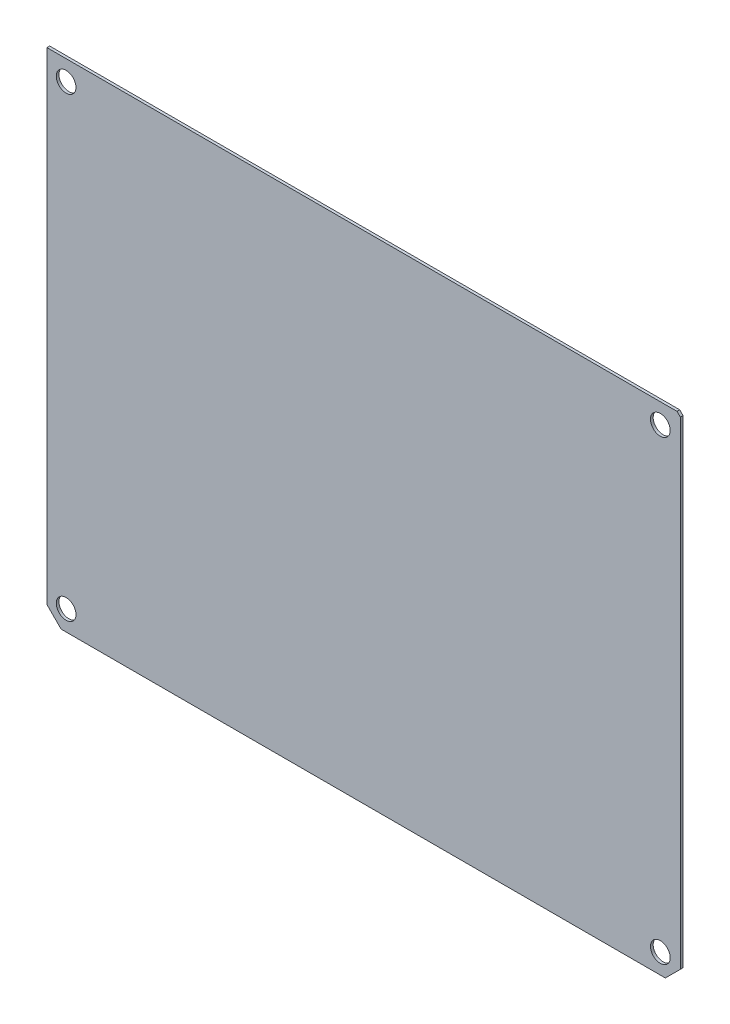
ISO-10303-21;
HEADER;
FILE_DESCRIPTION(('STEP AP214'),'2;1');
FILE_NAME('part.step','',(''),(''),'','','');
FILE_SCHEMA(('AUTOMOTIVE_DESIGN { 1 0 10303 214 1 1 1 1 }'));
ENDSEC;
DATA;
#1=APPLICATION_CONTEXT('core data for automotive mechanical design processes');
#2=APPLICATION_PROTOCOL_DEFINITION('international standard','automotive_design',2000,#1);
#3=PRODUCT_CONTEXT('',#1,'mechanical');
#4=PRODUCT('Part','Part','',(#3));
#5=PRODUCT_RELATED_PRODUCT_CATEGORY('part','',(#4));
#6=PRODUCT_DEFINITION_FORMATION('','',#4);
#7=PRODUCT_DEFINITION_CONTEXT('part definition',#1,'design');
#8=PRODUCT_DEFINITION('design','',#6,#7);
#9=PRODUCT_DEFINITION_SHAPE('','',#8);
#10=(LENGTH_UNIT() NAMED_UNIT(*) SI_UNIT(.MILLI.,.METRE.));
#11=(NAMED_UNIT(*) PLANE_ANGLE_UNIT() SI_UNIT($,.RADIAN.));
#12=(NAMED_UNIT(*) SI_UNIT($,.STERADIAN.) SOLID_ANGLE_UNIT());
#13=UNCERTAINTY_MEASURE_WITH_UNIT(LENGTH_MEASURE(1.E-05),#10,'distance_accuracy_value','');
#14=(GEOMETRIC_REPRESENTATION_CONTEXT(3) GLOBAL_UNCERTAINTY_ASSIGNED_CONTEXT((#13)) GLOBAL_UNIT_ASSIGNED_CONTEXT((#10,
#11,#12)) REPRESENTATION_CONTEXT('',''));
#15=CARTESIAN_POINT('',(0.,0.,0.));
#16=DIRECTION('',(0.,0.,1.));
#17=DIRECTION('',(1.,0.,0.));
#18=AXIS2_PLACEMENT_3D('',#15,#16,#17);
#19=CARTESIAN_POINT('',(143.00199890136,105.66400146484,0.));
#20=DIRECTION('',(0.,0.,-1.));
#21=DIRECTION('',(-1.,0.,0.));
#22=AXIS2_PLACEMENT_3D('',#19,#20,#21);
#23=PLANE('',#22);
#24=CARTESIAN_POINT('',(236.347,176.022,0.));
#25=DIRECTION('',(0.,0.,-1.));
#26=DIRECTION('',(-1.,0.,0.));
#27=AXIS2_PLACEMENT_3D('',#24,#25,#26);
#28=CIRCLE('',#27,1.49999954);
#29=CARTESIAN_POINT('',(234.84700046,176.022,0.));
#30=VERTEX_POINT('',#29);
#31=EDGE_CURVE('E108',#30,#30,#28,.T.);
#32=ORIENTED_EDGE('',*,*,#31,.T.);
#33=EDGE_LOOP('',(#32));
#34=FACE_BOUND('',#33,.T.);
#35=CARTESIAN_POINT('',(236.347,106.553,0.));
#36=DIRECTION('',(0.,0.,-1.));
#37=DIRECTION('',(-1.,0.,0.));
#38=AXIS2_PLACEMENT_3D('',#35,#36,#37);
#39=CIRCLE('',#38,1.49999954);
#40=CARTESIAN_POINT('',(234.84700046,106.553,0.));
#41=VERTEX_POINT('',#40);
#42=EDGE_CURVE('E112',#41,#41,#39,.T.);
#43=ORIENTED_EDGE('',*,*,#42,.T.);
#44=EDGE_LOOP('',(#43));
#45=FACE_BOUND('',#44,.T.);
#46=CARTESIAN_POINT('',(145.923,176.022,0.));
#47=DIRECTION('',(0.,0.,-1.));
#48=DIRECTION('',(-1.,0.,0.));
#49=AXIS2_PLACEMENT_3D('',#46,#47,#48);
#50=CIRCLE('',#49,1.49999954);
#51=CARTESIAN_POINT('',(144.42300046,176.022,0.));
#52=VERTEX_POINT('',#51);
#53=EDGE_CURVE('E114',#52,#52,#50,.T.);
#54=ORIENTED_EDGE('',*,*,#53,.T.);
#55=EDGE_LOOP('',(#54));
#56=FACE_BOUND('',#55,.T.);
#57=CARTESIAN_POINT('',(145.923,106.553,0.));
#58=DIRECTION('',(0.,0.,-1.));
#59=DIRECTION('',(-1.,0.,0.));
#60=AXIS2_PLACEMENT_3D('',#57,#58,#59);
#61=CIRCLE('',#60,1.49999954);
#62=CARTESIAN_POINT('',(144.42300046,106.553,0.));
#63=VERTEX_POINT('',#62);
#64=EDGE_CURVE('E18',#63,#63,#61,.T.);
#65=ORIENTED_EDGE('',*,*,#64,.T.);
#66=EDGE_LOOP('',(#65));
#67=FACE_BOUND('',#66,.T.);
#68=DIRECTION('',(1.,0.,0.));
#69=VECTOR('',#68,1.);
#70=CARTESIAN_POINT('',(145.16099548339,103.50499725341,0.));
#71=LINE('',#70,#69);
#72=CARTESIAN_POINT('',(145.160995483391,103.504997253411,0.));
#73=VERTEX_POINT('',#72);
#74=CARTESIAN_POINT('',(237.10899353027,103.50499725341,0.));
#75=VERTEX_POINT('',#74);
#76=EDGE_CURVE('E130',#73,#75,#71,.T.);
#77=ORIENTED_EDGE('',*,*,#76,.T.);
#78=DIRECTION('',(-0.707107961146063,-0.707105601225063,0.));
#79=VECTOR('',#78,1.);
#80=CARTESIAN_POINT('',(237.10899353027,103.50499725341,0.));
#81=LINE('',#80,#79);
#82=CARTESIAN_POINT('',(239.39500427246,105.79100036621,0.));
#83=VERTEX_POINT('',#82);
#84=EDGE_CURVE('E134',#75,#83,#81,.F.);
#85=ORIENTED_EDGE('',*,*,#84,.T.);
#86=DIRECTION('',(0.,1.,0.));
#87=VECTOR('',#86,1.);
#88=CARTESIAN_POINT('',(239.39500427246,105.79100036621,0.));
#89=LINE('',#88,#87);
#90=CARTESIAN_POINT('',(239.39500427246,178.56199645996,0.));
#91=VERTEX_POINT('',#90);
#92=EDGE_CURVE('E138',#83,#91,#89,.T.);
#93=ORIENTED_EDGE('',*,*,#92,.T.);
#94=DIRECTION('',(0.707106781186548,-0.707106781186548,0.));
#95=VECTOR('',#94,1.);
#96=CARTESIAN_POINT('',(239.39500427246,178.56199645996,0.));
#97=LINE('',#96,#95);
#98=CARTESIAN_POINT('',(238.886993408201,179.070007324211,0.));
#99=VERTEX_POINT('',#98);
#100=EDGE_CURVE('E72',#91,#99,#97,.F.);
#101=ORIENTED_EDGE('',*,*,#100,.T.);
#102=DIRECTION('',(1.,0.,0.));
#103=VECTOR('',#102,1.);
#104=CARTESIAN_POINT('',(238.8869934082,179.07000732421,0.));
#105=LINE('',#104,#103);
#106=CARTESIAN_POINT('',(143.00199890136,179.07000732421,0.));
#107=VERTEX_POINT('',#106);
#108=EDGE_CURVE('E74',#99,#107,#105,.F.);
#109=ORIENTED_EDGE('',*,*,#108,.T.);
#110=DIRECTION('',(0.,1.,0.));
#111=VECTOR('',#110,1.);
#112=CARTESIAN_POINT('',(143.00199890136,179.07000732421,0.));
#113=LINE('',#112,#111);
#114=CARTESIAN_POINT('',(143.00199890136,105.66400146484,0.));
#115=VERTEX_POINT('',#114);
#116=EDGE_CURVE('E76',#107,#115,#113,.F.);
#117=ORIENTED_EDGE('',*,*,#116,.T.);
#118=DIRECTION('',(-0.707105531811944,0.707108030558944,0.));
#119=VECTOR('',#118,1.);
#120=CARTESIAN_POINT('',(143.00199890136,105.66400146484,0.));
#121=LINE('',#120,#119);
#122=EDGE_CURVE('E121',#115,#73,#121,.F.);
#123=ORIENTED_EDGE('',*,*,#122,.T.);
#124=EDGE_LOOP('',(#77,#85,#93,#101,#109,#117,#123));
#125=FACE_BOUND('',#124,.T.);
#126=ADVANCED_FACE('F15',(#34,#45,#56,#67,#125),#23,.F.);
#127=CARTESIAN_POINT('',(143.00199890136,179.07000732421,-0.41148));
#128=DIRECTION('',(1.,0.,0.));
#129=DIRECTION('',(0.,0.,-1.));
#130=AXIS2_PLACEMENT_3D('',#127,#128,#129);
#131=PLANE('',#130);
#132=DIRECTION('',(0.,0.,1.));
#133=VECTOR('',#132,1.);
#134=CARTESIAN_POINT('',(143.00199890136,105.66400146484,-0.41148));
#135=LINE('',#134,#133);
#136=CARTESIAN_POINT('',(143.00199890136,105.66400146484,-0.41148));
#137=VERTEX_POINT('',#136);
#138=EDGE_CURVE('E87',#137,#115,#135,.T.);
#139=ORIENTED_EDGE('',*,*,#138,.T.);
#140=ORIENTED_EDGE('',*,*,#116,.F.);
#141=DIRECTION('',(0.,0.,-1.));
#142=VECTOR('',#141,1.);
#143=CARTESIAN_POINT('',(143.00199890136,179.07000732421,-0.41148));
#144=LINE('',#143,#142);
#145=CARTESIAN_POINT('',(143.00199890136,179.07000732421,-0.41148));
#146=VERTEX_POINT('',#145);
#147=EDGE_CURVE('E81',#107,#146,#144,.T.);
#148=ORIENTED_EDGE('',*,*,#147,.T.);
#149=DIRECTION('',(0.,1.,0.));
#150=VECTOR('',#149,1.);
#151=CARTESIAN_POINT('',(143.00199890136,105.66400146484,-0.41148));
#152=LINE('',#151,#150);
#153=EDGE_CURVE('E111',#137,#146,#152,.T.);
#154=ORIENTED_EDGE('',*,*,#153,.F.);
#155=EDGE_LOOP('',(#139,#140,#148,#154));
#156=FACE_BOUND('',#155,.T.);
#157=ADVANCED_FACE('F84',(#156),#131,.F.);
#158=CARTESIAN_POINT('',(238.8869934082,179.07000732421,-0.41148));
#159=DIRECTION('',(0.,-1.,0.));
#160=DIRECTION('',(0.,0.,-1.));
#161=AXIS2_PLACEMENT_3D('',#158,#159,#160);
#162=PLANE('',#161);
#163=ORIENTED_EDGE('',*,*,#147,.F.);
#164=ORIENTED_EDGE('',*,*,#108,.F.);
#165=DIRECTION('',(0.,0.,1.));
#166=VECTOR('',#165,1.);
#167=CARTESIAN_POINT('',(238.886993408205,179.070007324215,-0.41148));
#168=LINE('',#167,#166);
#169=CARTESIAN_POINT('',(238.886993408201,179.070007324211,-0.41148));
#170=VERTEX_POINT('',#169);
#171=EDGE_CURVE('E95',#99,#170,#168,.F.);
#172=ORIENTED_EDGE('',*,*,#171,.T.);
#173=DIRECTION('',(-1.,0.,0.));
#174=VECTOR('',#173,1.);
#175=CARTESIAN_POINT('',(143.00199890136,179.07000732421,-0.41148));
#176=LINE('',#175,#174);
#177=EDGE_CURVE('E92',#146,#170,#176,.F.);
#178=ORIENTED_EDGE('',*,*,#177,.F.);
#179=EDGE_LOOP('',(#163,#164,#172,#178));
#180=FACE_BOUND('',#179,.T.);
#181=ADVANCED_FACE('F90',(#180),#162,.F.);
#182=CARTESIAN_POINT('',(239.39500427246,178.56199645996,-0.41148));
#183=DIRECTION('',(-0.707106781186548,-0.707106781186548,0.));
#184=DIRECTION('',(0.707106781186548,-0.707106781186548,0.));
#185=AXIS2_PLACEMENT_3D('',#182,#183,#184);
#186=PLANE('',#185);
#187=ORIENTED_EDGE('',*,*,#171,.F.);
#188=ORIENTED_EDGE('',*,*,#100,.F.);
#189=DIRECTION('',(0.,0.,1.));
#190=VECTOR('',#189,1.);
#191=CARTESIAN_POINT('',(239.39500427246,178.56199645996,-0.41148));
#192=LINE('',#191,#190);
#193=CARTESIAN_POINT('',(239.39500427246,178.56199645996,-0.41148));
#194=VERTEX_POINT('',#193);
#195=EDGE_CURVE('E136',#91,#194,#192,.F.);
#196=ORIENTED_EDGE('',*,*,#195,.T.);
#197=DIRECTION('',(0.707106781193521,-0.707106781179574,0.));
#198=VECTOR('',#197,1.);
#199=CARTESIAN_POINT('',(238.8869934082,179.07000732421,-0.41148));
#200=LINE('',#199,#198);
#201=EDGE_CURVE('E142',#170,#194,#200,.T.);
#202=ORIENTED_EDGE('',*,*,#201,.F.);
#203=EDGE_LOOP('',(#187,#188,#196,#202));
#204=FACE_BOUND('',#203,.T.);
#205=ADVANCED_FACE('F143',(#204),#186,.F.);
#206=CARTESIAN_POINT('',(239.39500427246,105.79100036621,-0.41148));
#207=DIRECTION('',(-1.,0.,0.));
#208=DIRECTION('',(0.,0.,1.));
#209=AXIS2_PLACEMENT_3D('',#206,#207,#208);
#210=PLANE('',#209);
#211=ORIENTED_EDGE('',*,*,#195,.F.);
#212=ORIENTED_EDGE('',*,*,#92,.F.);
#213=DIRECTION('',(0.,0.,1.));
#214=VECTOR('',#213,1.);
#215=CARTESIAN_POINT('',(239.395004272462,105.791000366208,-0.41148));
#216=LINE('',#215,#214);
#217=CARTESIAN_POINT('',(239.39500427246,105.79100036621,-0.41148));
#218=VERTEX_POINT('',#217);
#219=EDGE_CURVE('E132',#83,#218,#216,.F.);
#220=ORIENTED_EDGE('',*,*,#219,.T.);
#221=DIRECTION('',(0.,1.,0.));
#222=VECTOR('',#221,1.);
#223=CARTESIAN_POINT('',(239.39500427246,105.66400146484,-0.41148));
#224=LINE('',#223,#222);
#225=EDGE_CURVE('E148',#194,#218,#224,.F.);
#226=ORIENTED_EDGE('',*,*,#225,.F.);
#227=EDGE_LOOP('',(#211,#212,#220,#226));
#228=FACE_BOUND('',#227,.T.);
#229=ADVANCED_FACE('F171',(#228),#210,.F.);
#230=CARTESIAN_POINT('',(237.10899353027,103.50499725341,-0.41148));
#231=DIRECTION('',(-0.707105601225063,0.707107961146063,0.));
#232=DIRECTION('',(-0.707107961146063,-0.707105601225063,0.));
#233=AXIS2_PLACEMENT_3D('',#230,#231,#232);
#234=PLANE('',#233);
#235=ORIENTED_EDGE('',*,*,#219,.F.);
#236=ORIENTED_EDGE('',*,*,#84,.F.);
#237=DIRECTION('',(0.,0.,1.));
#238=VECTOR('',#237,1.);
#239=CARTESIAN_POINT('',(237.10899353027,103.50499725341,-0.41148));
#240=LINE('',#239,#238);
#241=CARTESIAN_POINT('',(237.10899353027,103.50499725341,-0.41148));
#242=VERTEX_POINT('',#241);
#243=EDGE_CURVE('E128',#75,#242,#240,.F.);
#244=ORIENTED_EDGE('',*,*,#243,.T.);
#245=DIRECTION('',(-0.707107961145546,-0.70710560122558,0.));
#246=VECTOR('',#245,1.);
#247=CARTESIAN_POINT('',(239.39500427246,105.79100036621,-0.41148));
#248=LINE('',#247,#246);
#249=EDGE_CURVE('E155',#218,#242,#248,.T.);
#250=ORIENTED_EDGE('',*,*,#249,.F.);
#251=EDGE_LOOP('',(#235,#236,#244,#250));
#252=FACE_BOUND('',#251,.T.);
#253=ADVANCED_FACE('F168',(#252),#234,.F.);
#254=CARTESIAN_POINT('',(145.16099548339,103.50499725341,-0.41148));
#255=DIRECTION('',(0.,1.,0.));
#256=DIRECTION('',(0.,0.,1.));
#257=AXIS2_PLACEMENT_3D('',#254,#255,#256);
#258=PLANE('',#257);
#259=ORIENTED_EDGE('',*,*,#243,.F.);
#260=ORIENTED_EDGE('',*,*,#76,.F.);
#261=DIRECTION('',(0.,0.,1.));
#262=VECTOR('',#261,1.);
#263=CARTESIAN_POINT('',(145.160995483393,103.504997253413,-0.41148));
#264=LINE('',#263,#262);
#265=CARTESIAN_POINT('',(145.160995483391,103.504997253411,-0.41148));
#266=VERTEX_POINT('',#265);
#267=EDGE_CURVE('E33',#73,#266,#264,.F.);
#268=ORIENTED_EDGE('',*,*,#267,.T.);
#269=DIRECTION('',(-1.,0.,0.));
#270=VECTOR('',#269,1.);
#271=CARTESIAN_POINT('',(143.00199890136,103.50499725341,-0.41148));
#272=LINE('',#271,#270);
#273=EDGE_CURVE('E158',#242,#266,#272,.T.);
#274=ORIENTED_EDGE('',*,*,#273,.F.);
#275=EDGE_LOOP('',(#259,#260,#268,#274));
#276=FACE_BOUND('',#275,.T.);
#277=ADVANCED_FACE('F164',(#276),#258,.F.);
#278=CARTESIAN_POINT('',(143.00199890136,105.66400146484,-0.41148));
#279=DIRECTION('',(0.707108030558944,0.707105531811944,0.));
#280=DIRECTION('',(-0.707105531811944,0.707108030558944,0.));
#281=AXIS2_PLACEMENT_3D('',#278,#279,#280);
#282=PLANE('',#281);
#283=ORIENTED_EDGE('',*,*,#267,.F.);
#284=ORIENTED_EDGE('',*,*,#122,.F.);
#285=ORIENTED_EDGE('',*,*,#138,.F.);
#286=DIRECTION('',(-0.707105531810852,0.707108030560035,0.));
#287=VECTOR('',#286,1.);
#288=CARTESIAN_POINT('',(145.16099548339,103.50499725341,-0.41148));
#289=LINE('',#288,#287);
#290=EDGE_CURVE('E107',#266,#137,#289,.T.);
#291=ORIENTED_EDGE('',*,*,#290,.F.);
#292=EDGE_LOOP('',(#283,#284,#285,#291));
#293=FACE_BOUND('',#292,.T.);
#294=ADVANCED_FACE('F161',(#293),#282,.F.);
#295=CARTESIAN_POINT('',(145.923,106.553,-0.41148));
#296=DIRECTION('',(0.,0.,-1.));
#297=DIRECTION('',(-1.,0.,0.));
#298=AXIS2_PLACEMENT_3D('',#295,#296,#297);
#299=CYLINDRICAL_SURFACE('',#298,1.49999954);
#300=ORIENTED_EDGE('',*,*,#64,.F.);
#301=EDGE_LOOP('',(#300));
#302=FACE_BOUND('',#301,.T.);
#303=CARTESIAN_POINT('',(145.923,106.553,-0.41148));
#304=DIRECTION('',(0.,0.,-1.));
#305=DIRECTION('',(-1.,0.,0.));
#306=AXIS2_PLACEMENT_3D('',#303,#304,#305);
#307=CIRCLE('',#306,1.49999954);
#308=CARTESIAN_POINT('',(144.42300046,106.553,-0.41148));
#309=VERTEX_POINT('',#308);
#310=EDGE_CURVE('E104',#309,#309,#307,.F.);
#311=ORIENTED_EDGE('',*,*,#310,.F.);
#312=EDGE_LOOP('',(#311));
#313=FACE_BOUND('',#312,.T.);
#314=ADVANCED_FACE('F199',(#302,#313),#299,.F.);
#315=CARTESIAN_POINT('',(145.923,176.022,-0.41148));
#316=DIRECTION('',(0.,0.,-1.));
#317=DIRECTION('',(-1.,0.,0.));
#318=AXIS2_PLACEMENT_3D('',#315,#316,#317);
#319=CYLINDRICAL_SURFACE('',#318,1.49999954);
#320=ORIENTED_EDGE('',*,*,#53,.F.);
#321=EDGE_LOOP('',(#320));
#322=FACE_BOUND('',#321,.T.);
#323=CARTESIAN_POINT('',(145.923,176.022,-0.41148));
#324=DIRECTION('',(0.,0.,-1.));
#325=DIRECTION('',(-1.,0.,0.));
#326=AXIS2_PLACEMENT_3D('',#323,#324,#325);
#327=CIRCLE('',#326,1.49999954);
#328=CARTESIAN_POINT('',(144.42300046,176.022,-0.41148));
#329=VERTEX_POINT('',#328);
#330=EDGE_CURVE('E101',#329,#329,#327,.F.);
#331=ORIENTED_EDGE('',*,*,#330,.F.);
#332=EDGE_LOOP('',(#331));
#333=FACE_BOUND('',#332,.T.);
#334=ADVANCED_FACE('F195',(#322,#333),#319,.F.);
#335=CARTESIAN_POINT('',(236.347,106.553,-0.41148));
#336=DIRECTION('',(0.,0.,-1.));
#337=DIRECTION('',(-1.,0.,0.));
#338=AXIS2_PLACEMENT_3D('',#335,#336,#337);
#339=CYLINDRICAL_SURFACE('',#338,1.49999954);
#340=ORIENTED_EDGE('',*,*,#42,.F.);
#341=EDGE_LOOP('',(#340));
#342=FACE_BOUND('',#341,.T.);
#343=CARTESIAN_POINT('',(236.347,106.553,-0.41148));
#344=DIRECTION('',(0.,0.,-1.));
#345=DIRECTION('',(-1.,0.,0.));
#346=AXIS2_PLACEMENT_3D('',#343,#344,#345);
#347=CIRCLE('',#346,1.49999954);
#348=CARTESIAN_POINT('',(234.84700046,106.553,-0.41148));
#349=VERTEX_POINT('',#348);
#350=EDGE_CURVE('E24',#349,#349,#347,.F.);
#351=ORIENTED_EDGE('',*,*,#350,.F.);
#352=EDGE_LOOP('',(#351));
#353=FACE_BOUND('',#352,.T.);
#354=ADVANCED_FACE('F188',(#342,#353),#339,.F.);
#355=CARTESIAN_POINT('',(236.347,176.022,-0.41148));
#356=DIRECTION('',(0.,0.,-1.));
#357=DIRECTION('',(-1.,0.,0.));
#358=AXIS2_PLACEMENT_3D('',#355,#356,#357);
#359=CYLINDRICAL_SURFACE('',#358,1.49999954);
#360=ORIENTED_EDGE('',*,*,#31,.F.);
#361=EDGE_LOOP('',(#360));
#362=FACE_BOUND('',#361,.T.);
#363=CARTESIAN_POINT('',(236.347,176.022,-0.41148));
#364=DIRECTION('',(0.,0.,-1.));
#365=DIRECTION('',(-1.,0.,0.));
#366=AXIS2_PLACEMENT_3D('',#363,#364,#365);
#367=CIRCLE('',#366,1.49999954);
#368=CARTESIAN_POINT('',(234.84700046,176.022,-0.41148));
#369=VERTEX_POINT('',#368);
#370=EDGE_CURVE('E10',#369,#369,#367,.F.);
#371=ORIENTED_EDGE('',*,*,#370,.F.);
#372=EDGE_LOOP('',(#371));
#373=FACE_BOUND('',#372,.T.);
#374=ADVANCED_FACE('F182',(#362,#373),#359,.F.);
#375=CARTESIAN_POINT('',(143.00199890136,105.66400146484,-0.41148));
#376=DIRECTION('',(0.,0.,-1.));
#377=DIRECTION('',(-1.,0.,0.));
#378=AXIS2_PLACEMENT_3D('',#375,#376,#377);
#379=PLANE('',#378);
#380=ORIENTED_EDGE('',*,*,#370,.T.);
#381=EDGE_LOOP('',(#380));
#382=FACE_BOUND('',#381,.T.);
#383=ORIENTED_EDGE('',*,*,#350,.T.);
#384=EDGE_LOOP('',(#383));
#385=FACE_BOUND('',#384,.T.);
#386=ORIENTED_EDGE('',*,*,#330,.T.);
#387=EDGE_LOOP('',(#386));
#388=FACE_BOUND('',#387,.T.);
#389=ORIENTED_EDGE('',*,*,#310,.T.);
#390=EDGE_LOOP('',(#389));
#391=FACE_BOUND('',#390,.T.);
#392=ORIENTED_EDGE('',*,*,#273,.T.);
#393=ORIENTED_EDGE('',*,*,#290,.T.);
#394=ORIENTED_EDGE('',*,*,#153,.T.);
#395=ORIENTED_EDGE('',*,*,#177,.T.);
#396=ORIENTED_EDGE('',*,*,#201,.T.);
#397=ORIENTED_EDGE('',*,*,#225,.T.);
#398=ORIENTED_EDGE('',*,*,#249,.T.);
#399=EDGE_LOOP('',(#392,#393,#394,#395,#396,#397,#398));
#400=FACE_BOUND('',#399,.T.);
#401=ADVANCED_FACE('F151',(#382,#385,#388,#391,#400),#379,.T.);
#402=CLOSED_SHELL('',(#126,#157,#181,#205,#229,#253,#277,#294,#314,#334,#354,#374,#401));
#403=MANIFOLD_SOLID_BREP('B1',#402);
#404=ADVANCED_BREP_SHAPE_REPRESENTATION('',(#18,#403),#14);
#405=SHAPE_DEFINITION_REPRESENTATION(#9,#404);
ENDSEC;
END-ISO-10303-21;
